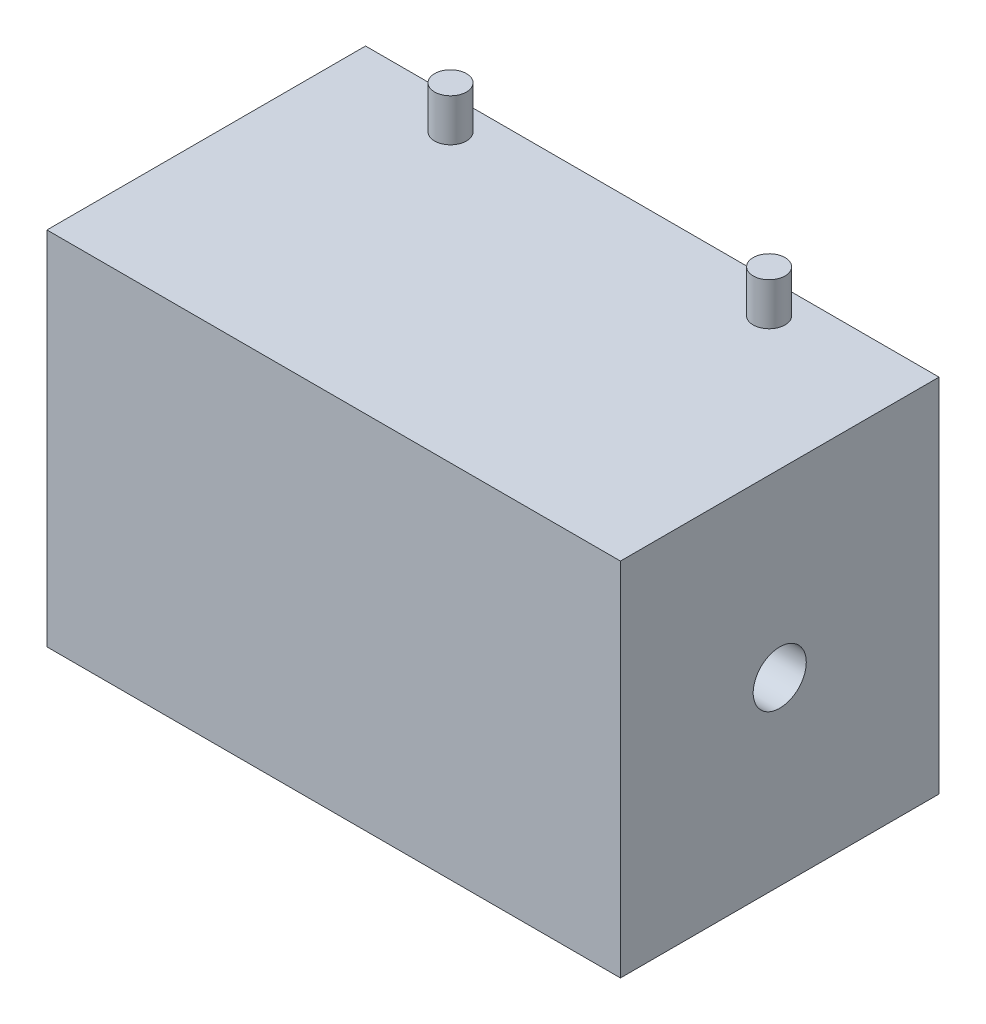
ISO-10303-21;
HEADER;
FILE_DESCRIPTION(('STEP AP214'),'2;1');
FILE_NAME('part.step','',(''),(''),'','','');
FILE_SCHEMA(('AUTOMOTIVE_DESIGN { 1 0 10303 214 1 1 1 1 }'));
ENDSEC;
DATA;
#1=APPLICATION_CONTEXT('core data for automotive mechanical design processes');
#2=APPLICATION_PROTOCOL_DEFINITION('international standard','automotive_design',2000,#1);
#3=PRODUCT_CONTEXT('',#1,'mechanical');
#4=PRODUCT('Part','Part','',(#3));
#5=PRODUCT_RELATED_PRODUCT_CATEGORY('part','',(#4));
#6=PRODUCT_DEFINITION_FORMATION('','',#4);
#7=PRODUCT_DEFINITION_CONTEXT('part definition',#1,'design');
#8=PRODUCT_DEFINITION('design','',#6,#7);
#9=PRODUCT_DEFINITION_SHAPE('','',#8);
#10=(LENGTH_UNIT() NAMED_UNIT(*) SI_UNIT(.MILLI.,.METRE.));
#11=(NAMED_UNIT(*) PLANE_ANGLE_UNIT() SI_UNIT($,.RADIAN.));
#12=(NAMED_UNIT(*) SI_UNIT($,.STERADIAN.) SOLID_ANGLE_UNIT());
#13=UNCERTAINTY_MEASURE_WITH_UNIT(LENGTH_MEASURE(1.E-05),#10,'distance_accuracy_value','');
#14=(GEOMETRIC_REPRESENTATION_CONTEXT(3) GLOBAL_UNCERTAINTY_ASSIGNED_CONTEXT((#13)) GLOBAL_UNIT_ASSIGNED_CONTEXT((#10,
#11,#12)) REPRESENTATION_CONTEXT('',''));
#15=CARTESIAN_POINT('',(0.,0.,0.));
#16=DIRECTION('',(0.,0.,1.));
#17=DIRECTION('',(1.,0.,0.));
#18=AXIS2_PLACEMENT_3D('',#15,#16,#17);
#19=CARTESIAN_POINT('',(0.,0.,150.));
#20=DIRECTION('',(1.,0.,0.));
#21=DIRECTION('',(0.,0.,-1.));
#22=AXIS2_PLACEMENT_3D('',#19,#20,#21);
#23=PLANE('',#22);
#24=DIRECTION('',(0.,-1.,0.));
#25=VECTOR('',#24,1.);
#26=CARTESIAN_POINT('',(0.,0.,0.));
#27=LINE('',#26,#25);
#28=CARTESIAN_POINT('',(0.,170.,0.));
#29=VERTEX_POINT('',#28);
#30=CARTESIAN_POINT('',(0.,0.,0.));
#31=VERTEX_POINT('',#30);
#32=EDGE_CURVE('E112',#29,#31,#27,.T.);
#33=ORIENTED_EDGE('',*,*,#32,.T.);
#34=DIRECTION('',(0.,0.,-1.));
#35=VECTOR('',#34,1.);
#36=CARTESIAN_POINT('',(0.,0.,150.));
#37=LINE('',#36,#35);
#38=CARTESIAN_POINT('',(0.,0.,150.));
#39=VERTEX_POINT('',#38);
#40=EDGE_CURVE('E11',#39,#31,#37,.T.);
#41=ORIENTED_EDGE('',*,*,#40,.F.);
#42=DIRECTION('',(0.,-1.,0.));
#43=VECTOR('',#42,1.);
#44=CARTESIAN_POINT('',(0.,0.,150.));
#45=LINE('',#44,#43);
#46=CARTESIAN_POINT('',(0.,170.,150.));
#47=VERTEX_POINT('',#46);
#48=EDGE_CURVE('E95',#47,#39,#45,.T.);
#49=ORIENTED_EDGE('',*,*,#48,.F.);
#50=DIRECTION('',(0.,0.,-1.));
#51=VECTOR('',#50,1.);
#52=CARTESIAN_POINT('',(0.,170.,150.));
#53=LINE('',#52,#51);
#54=EDGE_CURVE('E108',#47,#29,#53,.T.);
#55=ORIENTED_EDGE('',*,*,#54,.T.);
#56=EDGE_LOOP('',(#33,#41,#49,#55));
#57=FACE_BOUND('',#56,.T.);
#58=ADVANCED_FACE('F41',(#57),#23,.F.);
#59=CARTESIAN_POINT('',(0.,0.,150.));
#60=DIRECTION('',(0.,1.,0.));
#61=DIRECTION('',(0.,0.,1.));
#62=AXIS2_PLACEMENT_3D('',#59,#60,#61);
#63=PLANE('',#62);
#64=CARTESIAN_POINT('',(205.,0.,15.));
#65=DIRECTION('',(0.,1.,0.));
#66=DIRECTION('',(0.,0.,1.));
#67=AXIS2_PLACEMENT_3D('',#64,#65,#66);
#68=CIRCLE('',#67,7.50000000000001);
#69=CARTESIAN_POINT('',(205.,0.,22.5));
#70=VERTEX_POINT('',#69);
#71=EDGE_CURVE('E145',#70,#70,#68,.T.);
#72=ORIENTED_EDGE('',*,*,#71,.T.);
#73=EDGE_LOOP('',(#72));
#74=FACE_BOUND('',#73,.T.);
#75=CARTESIAN_POINT('',(55.,0.,15.));
#76=DIRECTION('',(0.,1.,0.));
#77=DIRECTION('',(0.,0.,1.));
#78=AXIS2_PLACEMENT_3D('',#75,#76,#77);
#79=CIRCLE('',#78,7.50000000000001);
#80=CARTESIAN_POINT('',(55.,0.,22.5));
#81=VERTEX_POINT('',#80);
#82=EDGE_CURVE('E129',#81,#81,#79,.T.);
#83=ORIENTED_EDGE('',*,*,#82,.T.);
#84=EDGE_LOOP('',(#83));
#85=FACE_BOUND('',#84,.T.);
#86=DIRECTION('',(1.,0.,0.));
#87=VECTOR('',#86,1.);
#88=CARTESIAN_POINT('',(0.,0.,0.));
#89=LINE('',#88,#87);
#90=CARTESIAN_POINT('',(270.,0.,0.));
#91=VERTEX_POINT('',#90);
#92=EDGE_CURVE('E100',#31,#91,#89,.T.);
#93=ORIENTED_EDGE('',*,*,#92,.T.);
#94=DIRECTION('',(0.,0.,-1.));
#95=VECTOR('',#94,1.);
#96=CARTESIAN_POINT('',(270.,0.,150.));
#97=LINE('',#96,#95);
#98=CARTESIAN_POINT('',(270.,0.,150.));
#99=VERTEX_POINT('',#98);
#100=EDGE_CURVE('E51',#99,#91,#97,.T.);
#101=ORIENTED_EDGE('',*,*,#100,.F.);
#102=DIRECTION('',(1.,0.,0.));
#103=VECTOR('',#102,1.);
#104=CARTESIAN_POINT('',(0.,0.,150.));
#105=LINE('',#104,#103);
#106=EDGE_CURVE('E90',#39,#99,#105,.T.);
#107=ORIENTED_EDGE('',*,*,#106,.F.);
#108=ORIENTED_EDGE('',*,*,#40,.T.);
#109=EDGE_LOOP('',(#93,#101,#107,#108));
#110=FACE_BOUND('',#109,.T.);
#111=ADVANCED_FACE('F99',(#74,#85,#110),#63,.F.);
#112=CARTESIAN_POINT('',(270.,0.,150.));
#113=DIRECTION('',(-1.,0.,0.));
#114=DIRECTION('',(0.,0.,1.));
#115=AXIS2_PLACEMENT_3D('',#112,#113,#114);
#116=PLANE('',#115);
#117=CARTESIAN_POINT('',(270.,85.,75.));
#118=DIRECTION('',(1.,0.,0.));
#119=DIRECTION('',(0.,0.,-1.));
#120=AXIS2_PLACEMENT_3D('',#117,#118,#119);
#121=CIRCLE('',#120,12.5);
#122=CARTESIAN_POINT('',(270.,85.,62.5));
#123=VERTEX_POINT('',#122);
#124=EDGE_CURVE('E136',#123,#123,#121,.T.);
#125=ORIENTED_EDGE('',*,*,#124,.F.);
#126=EDGE_LOOP('',(#125));
#127=FACE_BOUND('',#126,.T.);
#128=DIRECTION('',(0.,1.,0.));
#129=VECTOR('',#128,1.);
#130=CARTESIAN_POINT('',(270.,0.,0.));
#131=LINE('',#130,#129);
#132=CARTESIAN_POINT('',(270.,170.,0.));
#133=VERTEX_POINT('',#132);
#134=EDGE_CURVE('E77',#91,#133,#131,.T.);
#135=ORIENTED_EDGE('',*,*,#134,.T.);
#136=DIRECTION('',(0.,0.,-1.));
#137=VECTOR('',#136,1.);
#138=CARTESIAN_POINT('',(270.,170.,150.));
#139=LINE('',#138,#137);
#140=CARTESIAN_POINT('',(270.,170.,150.));
#141=VERTEX_POINT('',#140);
#142=EDGE_CURVE('E102',#141,#133,#139,.T.);
#143=ORIENTED_EDGE('',*,*,#142,.F.);
#144=DIRECTION('',(0.,1.,0.));
#145=VECTOR('',#144,1.);
#146=CARTESIAN_POINT('',(270.,0.,150.));
#147=LINE('',#146,#145);
#148=EDGE_CURVE('E93',#99,#141,#147,.T.);
#149=ORIENTED_EDGE('',*,*,#148,.F.);
#150=ORIENTED_EDGE('',*,*,#100,.T.);
#151=EDGE_LOOP('',(#135,#143,#149,#150));
#152=FACE_BOUND('',#151,.T.);
#153=ADVANCED_FACE('F104',(#127,#152),#116,.F.);
#154=CARTESIAN_POINT('',(0.,170.,150.));
#155=DIRECTION('',(0.,-1.,0.));
#156=DIRECTION('',(0.,0.,-1.));
#157=AXIS2_PLACEMENT_3D('',#154,#155,#156);
#158=PLANE('',#157);
#159=CARTESIAN_POINT('',(205.,170.,15.));
#160=DIRECTION('',(0.,-1.,0.));
#161=DIRECTION('',(0.,0.,-1.));
#162=AXIS2_PLACEMENT_3D('',#159,#160,#161);
#163=CIRCLE('',#162,7.50000000000001);
#164=CARTESIAN_POINT('',(205.,170.,7.49999999999997));
#165=VERTEX_POINT('',#164);
#166=EDGE_CURVE('E44',#165,#165,#163,.T.);
#167=ORIENTED_EDGE('',*,*,#166,.T.);
#168=EDGE_LOOP('',(#167));
#169=FACE_BOUND('',#168,.T.);
#170=CARTESIAN_POINT('',(55.,170.,15.));
#171=DIRECTION('',(0.,-1.,0.));
#172=DIRECTION('',(0.,0.,-1.));
#173=AXIS2_PLACEMENT_3D('',#170,#171,#172);
#174=CIRCLE('',#173,7.50000000000001);
#175=CARTESIAN_POINT('',(55.,170.,7.49999999999998));
#176=VERTEX_POINT('',#175);
#177=EDGE_CURVE('E126',#176,#176,#174,.T.);
#178=ORIENTED_EDGE('',*,*,#177,.T.);
#179=EDGE_LOOP('',(#178));
#180=FACE_BOUND('',#179,.T.);
#181=DIRECTION('',(-1.,0.,0.));
#182=VECTOR('',#181,1.);
#183=CARTESIAN_POINT('',(0.,170.,0.));
#184=LINE('',#183,#182);
#185=EDGE_CURVE('E83',#133,#29,#184,.T.);
#186=ORIENTED_EDGE('',*,*,#185,.T.);
#187=ORIENTED_EDGE('',*,*,#54,.F.);
#188=DIRECTION('',(-1.,0.,0.));
#189=VECTOR('',#188,1.);
#190=CARTESIAN_POINT('',(0.,170.,150.));
#191=LINE('',#190,#189);
#192=EDGE_CURVE('E60',#141,#47,#191,.T.);
#193=ORIENTED_EDGE('',*,*,#192,.F.);
#194=ORIENTED_EDGE('',*,*,#142,.T.);
#195=EDGE_LOOP('',(#186,#187,#193,#194));
#196=FACE_BOUND('',#195,.T.);
#197=ADVANCED_FACE('F160',(#169,#180,#196),#158,.F.);
#198=CARTESIAN_POINT('',(0.,0.,150.));
#199=DIRECTION('',(0.,0.,-1.));
#200=DIRECTION('',(-1.,0.,0.));
#201=AXIS2_PLACEMENT_3D('',#198,#199,#200);
#202=PLANE('',#201);
#203=ORIENTED_EDGE('',*,*,#48,.T.);
#204=ORIENTED_EDGE('',*,*,#106,.T.);
#205=ORIENTED_EDGE('',*,*,#148,.T.);
#206=ORIENTED_EDGE('',*,*,#192,.T.);
#207=EDGE_LOOP('',(#203,#204,#205,#206));
#208=FACE_BOUND('',#207,.T.);
#209=ADVANCED_FACE('F91',(#208),#202,.F.);
#210=CARTESIAN_POINT('',(0.,0.,0.));
#211=DIRECTION('',(0.,0.,-1.));
#212=DIRECTION('',(-1.,0.,0.));
#213=AXIS2_PLACEMENT_3D('',#210,#211,#212);
#214=PLANE('',#213);
#215=ORIENTED_EDGE('',*,*,#32,.F.);
#216=ORIENTED_EDGE('',*,*,#185,.F.);
#217=ORIENTED_EDGE('',*,*,#134,.F.);
#218=ORIENTED_EDGE('',*,*,#92,.F.);
#219=EDGE_LOOP('',(#215,#216,#217,#218));
#220=FACE_BOUND('',#219,.T.);
#221=ADVANCED_FACE('F175',(#220),#214,.T.);
#222=CARTESIAN_POINT('',(70.,85.,75.));
#223=DIRECTION('',(1.,0.,0.));
#224=DIRECTION('',(0.,0.,-1.));
#225=AXIS2_PLACEMENT_3D('',#222,#223,#224);
#226=CYLINDRICAL_SURFACE('',#225,12.5);
#227=CARTESIAN_POINT('',(70.,85.,75.));
#228=DIRECTION('',(1.,0.,0.));
#229=DIRECTION('',(0.,0.,-1.));
#230=AXIS2_PLACEMENT_3D('',#227,#228,#229);
#231=CIRCLE('',#230,12.5);
#232=CARTESIAN_POINT('',(70.,85.,62.5));
#233=VERTEX_POINT('',#232);
#234=EDGE_CURVE('E116',#233,#233,#231,.T.);
#235=ORIENTED_EDGE('',*,*,#234,.F.);
#236=EDGE_LOOP('',(#235));
#237=FACE_BOUND('',#236,.T.);
#238=ORIENTED_EDGE('',*,*,#124,.T.);
#239=EDGE_LOOP('',(#238));
#240=FACE_BOUND('',#239,.T.);
#241=ADVANCED_FACE('F157',(#237,#240),#226,.F.);
#242=CARTESIAN_POINT('',(70.,85.,75.));
#243=DIRECTION('',(1.,0.,0.));
#244=DIRECTION('',(0.,0.,-1.));
#245=AXIS2_PLACEMENT_3D('',#242,#243,#244);
#246=PLANE('',#245);
#247=ORIENTED_EDGE('',*,*,#234,.T.);
#248=EDGE_LOOP('',(#247));
#249=FACE_BOUND('',#248,.T.);
#250=ADVANCED_FACE('F182',(#249),#246,.T.);
#251=CARTESIAN_POINT('',(55.,190.,15.));
#252=DIRECTION('',(0.,-1.,0.));
#253=DIRECTION('',(0.,0.,-1.));
#254=AXIS2_PLACEMENT_3D('',#251,#252,#253);
#255=PLANE('',#254);
#256=CARTESIAN_POINT('',(55.,190.,15.));
#257=DIRECTION('',(0.,-1.,0.));
#258=DIRECTION('',(0.,0.,-1.));
#259=AXIS2_PLACEMENT_3D('',#256,#257,#258);
#260=CIRCLE('',#259,7.50000000000001);
#261=CARTESIAN_POINT('',(55.,190.,7.49999999999998));
#262=VERTEX_POINT('',#261);
#263=EDGE_CURVE('E130',#262,#262,#260,.T.);
#264=ORIENTED_EDGE('',*,*,#263,.F.);
#265=EDGE_LOOP('',(#264));
#266=FACE_BOUND('',#265,.T.);
#267=ADVANCED_FACE('F189',(#266),#255,.F.);
#268=CARTESIAN_POINT('',(55.,190.,15.));
#269=DIRECTION('',(0.,-1.,0.));
#270=DIRECTION('',(0.,0.,-1.));
#271=AXIS2_PLACEMENT_3D('',#268,#269,#270);
#272=CYLINDRICAL_SURFACE('',#271,7.50000000000001);
#273=ORIENTED_EDGE('',*,*,#263,.T.);
#274=EDGE_LOOP('',(#273));
#275=FACE_BOUND('',#274,.T.);
#276=ORIENTED_EDGE('',*,*,#177,.F.);
#277=EDGE_LOOP('',(#276));
#278=FACE_BOUND('',#277,.T.);
#279=ADVANCED_FACE('F195',(#275,#278),#272,.T.);
#280=CARTESIAN_POINT('',(55.,-20.,15.));
#281=DIRECTION('',(0.,-1.,0.));
#282=DIRECTION('',(0.,0.,-1.));
#283=AXIS2_PLACEMENT_3D('',#280,#281,#282);
#284=CIRCLE('',#283,7.50000000000001);
#285=CARTESIAN_POINT('',(55.,-20.,7.49999999999998));
#286=VERTEX_POINT('',#285);
#287=EDGE_CURVE('E139',#286,#286,#284,.T.);
#288=ORIENTED_EDGE('',*,*,#287,.F.);
#289=EDGE_LOOP('',(#288));
#290=FACE_BOUND('',#289,.T.);
#291=ORIENTED_EDGE('',*,*,#82,.F.);
#292=EDGE_LOOP('',(#291));
#293=FACE_BOUND('',#292,.T.);
#294=ADVANCED_FACE('F191',(#290,#293),#272,.T.);
#295=CARTESIAN_POINT('',(55.,-20.,15.));
#296=DIRECTION('',(0.,-1.,0.));
#297=DIRECTION('',(0.,0.,-1.));
#298=AXIS2_PLACEMENT_3D('',#295,#296,#297);
#299=PLANE('',#298);
#300=ORIENTED_EDGE('',*,*,#287,.T.);
#301=EDGE_LOOP('',(#300));
#302=FACE_BOUND('',#301,.T.);
#303=ADVANCED_FACE('F194',(#302),#299,.T.);
#304=CARTESIAN_POINT('',(205.,190.,15.));
#305=DIRECTION('',(0.,-1.,0.));
#306=DIRECTION('',(0.,0.,-1.));
#307=AXIS2_PLACEMENT_3D('',#304,#305,#306);
#308=PLANE('',#307);
#309=CARTESIAN_POINT('',(205.,190.,15.));
#310=DIRECTION('',(0.,-1.,0.));
#311=DIRECTION('',(0.,0.,-1.));
#312=AXIS2_PLACEMENT_3D('',#309,#310,#311);
#313=CIRCLE('',#312,7.50000000000001);
#314=CARTESIAN_POINT('',(205.,190.,7.49999999999997));
#315=VERTEX_POINT('',#314);
#316=EDGE_CURVE('E221',#315,#315,#313,.T.);
#317=ORIENTED_EDGE('',*,*,#316,.F.);
#318=EDGE_LOOP('',(#317));
#319=FACE_BOUND('',#318,.T.);
#320=ADVANCED_FACE('F202',(#319),#308,.F.);
#321=CARTESIAN_POINT('',(205.,190.,15.));
#322=DIRECTION('',(0.,-1.,0.));
#323=DIRECTION('',(0.,0.,-1.));
#324=AXIS2_PLACEMENT_3D('',#321,#322,#323);
#325=CYLINDRICAL_SURFACE('',#324,7.50000000000001);
#326=ORIENTED_EDGE('',*,*,#316,.T.);
#327=EDGE_LOOP('',(#326));
#328=FACE_BOUND('',#327,.T.);
#329=ORIENTED_EDGE('',*,*,#166,.F.);
#330=EDGE_LOOP('',(#329));
#331=FACE_BOUND('',#330,.T.);
#332=ADVANCED_FACE('F208',(#328,#331),#325,.T.);
#333=CARTESIAN_POINT('',(205.,-20.,15.));
#334=DIRECTION('',(0.,-1.,0.));
#335=DIRECTION('',(0.,0.,-1.));
#336=AXIS2_PLACEMENT_3D('',#333,#334,#335);
#337=CIRCLE('',#336,7.50000000000001);
#338=CARTESIAN_POINT('',(205.,-20.,7.49999999999997));
#339=VERTEX_POINT('',#338);
#340=EDGE_CURVE('E219',#339,#339,#337,.T.);
#341=ORIENTED_EDGE('',*,*,#340,.F.);
#342=EDGE_LOOP('',(#341));
#343=FACE_BOUND('',#342,.T.);
#344=ORIENTED_EDGE('',*,*,#71,.F.);
#345=EDGE_LOOP('',(#344));
#346=FACE_BOUND('',#345,.T.);
#347=ADVANCED_FACE('F204',(#343,#346),#325,.T.);
#348=CARTESIAN_POINT('',(205.,-20.,15.));
#349=DIRECTION('',(0.,-1.,0.));
#350=DIRECTION('',(0.,0.,-1.));
#351=AXIS2_PLACEMENT_3D('',#348,#349,#350);
#352=PLANE('',#351);
#353=ORIENTED_EDGE('',*,*,#340,.T.);
#354=EDGE_LOOP('',(#353));
#355=FACE_BOUND('',#354,.T.);
#356=ADVANCED_FACE('F207',(#355),#352,.T.);
#357=CLOSED_SHELL('',(#58,#111,#153,#197,#209,#221,#241,#250,#267,#279,#294,#303,#320,#332,#347,#356));
#358=MANIFOLD_SOLID_BREP('B2',#357);
#359=ADVANCED_BREP_SHAPE_REPRESENTATION('',(#18,#358),#14);
#360=SHAPE_DEFINITION_REPRESENTATION(#9,#359);
ENDSEC;
END-ISO-10303-21;
